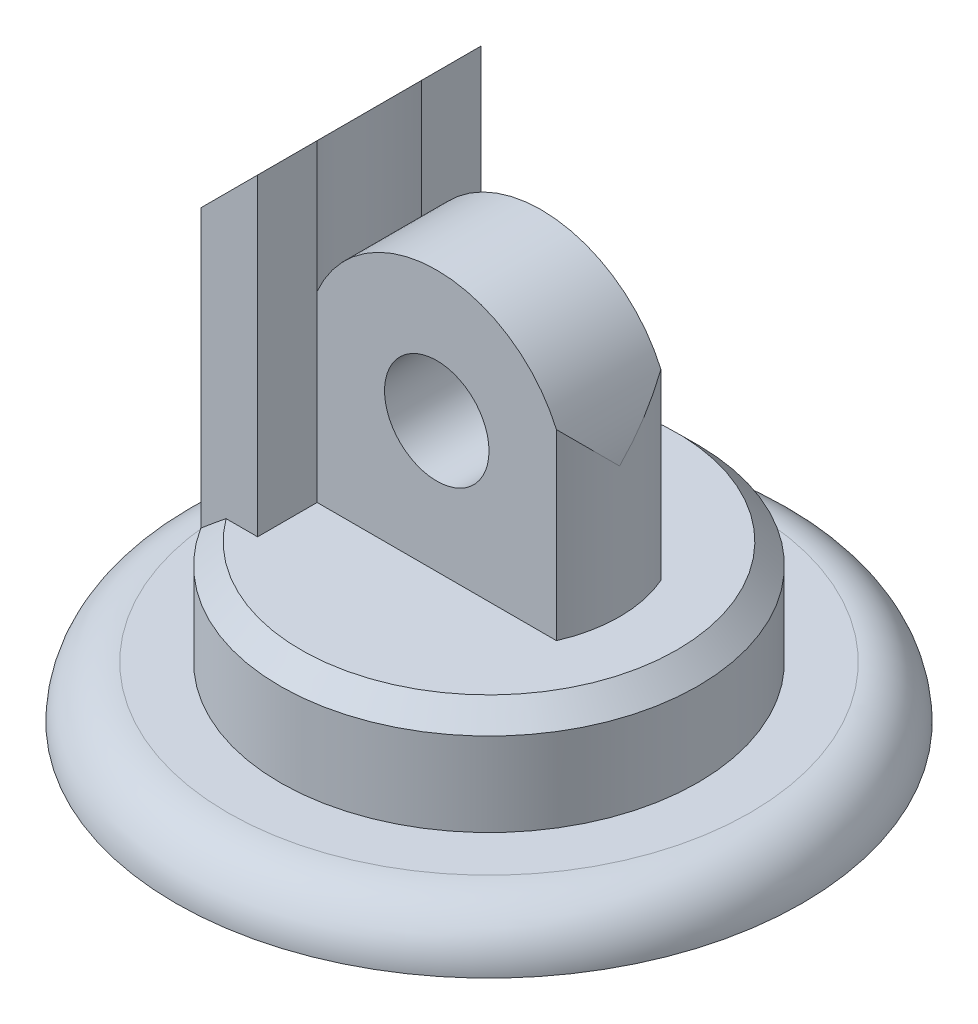
ISO-10303-21;
HEADER;
FILE_DESCRIPTION(('STEP AP214'),'2;1');
FILE_NAME('part.step','',(''),(''),'','','');
FILE_SCHEMA(('AUTOMOTIVE_DESIGN { 1 0 10303 214 1 1 1 1 }'));
ENDSEC;
DATA;
#1=APPLICATION_CONTEXT('core data for automotive mechanical design processes');
#2=APPLICATION_PROTOCOL_DEFINITION('international standard','automotive_design',2000,#1);
#3=PRODUCT_CONTEXT('',#1,'mechanical');
#4=PRODUCT('Part','Part','',(#3));
#5=PRODUCT_RELATED_PRODUCT_CATEGORY('part','',(#4));
#6=PRODUCT_DEFINITION_FORMATION('','',#4);
#7=PRODUCT_DEFINITION_CONTEXT('part definition',#1,'design');
#8=PRODUCT_DEFINITION('design','',#6,#7);
#9=PRODUCT_DEFINITION_SHAPE('','',#8);
#10=(LENGTH_UNIT() NAMED_UNIT(*) SI_UNIT(.MILLI.,.METRE.));
#11=(NAMED_UNIT(*) PLANE_ANGLE_UNIT() SI_UNIT($,.RADIAN.));
#12=(NAMED_UNIT(*) SI_UNIT($,.STERADIAN.) SOLID_ANGLE_UNIT());
#13=UNCERTAINTY_MEASURE_WITH_UNIT(LENGTH_MEASURE(1.E-05),#10,'distance_accuracy_value','');
#14=(GEOMETRIC_REPRESENTATION_CONTEXT(3) GLOBAL_UNCERTAINTY_ASSIGNED_CONTEXT((#13)) GLOBAL_UNIT_ASSIGNED_CONTEXT((#10,
#11,#12)) REPRESENTATION_CONTEXT('',''));
#15=CARTESIAN_POINT('',(0.,0.,0.));
#16=DIRECTION('',(0.,0.,1.));
#17=DIRECTION('',(1.,0.,0.));
#18=AXIS2_PLACEMENT_3D('',#15,#16,#17);
#19=CARTESIAN_POINT('',(0.,-25.,0.));
#20=DIRECTION('',(0.,-1.,0.));
#21=DIRECTION('',(0.,0.,-1.));
#22=AXIS2_PLACEMENT_3D('',#19,#20,#21);
#23=PLANE('',#22);
#24=DIRECTION('',(1.,0.,0.));
#25=VECTOR('',#24,1.);
#26=CARTESIAN_POINT('',(-22.9128784747792,-25.,21.393596310755));
#27=LINE('',#26,#25);
#28=CARTESIAN_POINT('',(-28.9536532564105,-25.,21.393596310755));
#29=VERTEX_POINT('',#28);
#30=CARTESIAN_POINT('',(-22.9128784747792,-25.,21.393596310755));
#31=VERTEX_POINT('',#30);
#32=EDGE_CURVE('E160',#29,#31,#27,.T.);
#33=ORIENTED_EDGE('',*,*,#32,.F.);
#34=CARTESIAN_POINT('',(0.,-25.,0.));
#35=DIRECTION('',(0.,-1.,0.));
#36=DIRECTION('',(0.,0.,-1.));
#37=AXIS2_PLACEMENT_3D('',#34,#35,#36);
#38=CIRCLE('',#37,36.);
#39=CARTESIAN_POINT('',(-28.9536532564105,-25.,-21.393596310755));
#40=VERTEX_POINT('',#39);
#41=EDGE_CURVE('E80',#29,#40,#38,.F.);
#42=ORIENTED_EDGE('',*,*,#41,.T.);
#43=DIRECTION('',(-1.,0.,0.));
#44=VECTOR('',#43,1.);
#45=CARTESIAN_POINT('',(-22.9128784747792,-25.,-21.393596310755));
#46=LINE('',#45,#44);
#47=CARTESIAN_POINT('',(-22.9128784747792,-25.,-21.393596310755));
#48=VERTEX_POINT('',#47);
#49=EDGE_CURVE('E181',#48,#40,#46,.T.);
#50=ORIENTED_EDGE('',*,*,#49,.F.);
#51=DIRECTION('',(0.,0.,-1.));
#52=VECTOR('',#51,1.);
#53=CARTESIAN_POINT('',(-22.9128784747792,-25.,-10.));
#54=LINE('',#53,#52);
#55=CARTESIAN_POINT('',(-22.9128784747792,-25.,-10.));
#56=VERTEX_POINT('',#55);
#57=EDGE_CURVE('E178',#56,#48,#54,.T.);
#58=ORIENTED_EDGE('',*,*,#57,.F.);
#59=DIRECTION('',(1.,0.,0.));
#60=VECTOR('',#59,1.);
#61=CARTESIAN_POINT('',(-25.,-25.,-10.));
#62=LINE('',#61,#60);
#63=CARTESIAN_POINT('',(22.9128784747792,-25.,-10.));
#64=VERTEX_POINT('',#63);
#65=EDGE_CURVE('E235',#56,#64,#62,.T.);
#66=ORIENTED_EDGE('',*,*,#65,.T.);
#67=CARTESIAN_POINT('',(0.,-25.,0.));
#68=DIRECTION('',(0.,1.,0.));
#69=DIRECTION('',(0.,0.,1.));
#70=AXIS2_PLACEMENT_3D('',#67,#68,#69);
#71=CIRCLE('',#70,25.);
#72=CARTESIAN_POINT('',(22.9128784747792,-25.,10.));
#73=VERTEX_POINT('',#72);
#74=EDGE_CURVE('E221',#73,#64,#71,.T.);
#75=ORIENTED_EDGE('',*,*,#74,.F.);
#76=DIRECTION('',(1.,0.,0.));
#77=VECTOR('',#76,1.);
#78=CARTESIAN_POINT('',(-25.,-25.,10.));
#79=LINE('',#78,#77);
#80=CARTESIAN_POINT('',(-22.9128784747792,-25.,10.));
#81=VERTEX_POINT('',#80);
#82=EDGE_CURVE('E227',#81,#73,#79,.T.);
#83=ORIENTED_EDGE('',*,*,#82,.F.);
#84=DIRECTION('',(0.,0.,-1.));
#85=VECTOR('',#84,1.);
#86=CARTESIAN_POINT('',(-22.9128784747792,-25.,10.));
#87=LINE('',#86,#85);
#88=EDGE_CURVE('E174',#31,#81,#87,.T.);
#89=ORIENTED_EDGE('',*,*,#88,.F.);
#90=EDGE_LOOP('',(#33,#42,#50,#58,#66,#75,#83,#89));
#91=FACE_BOUND('',#90,.T.);
#92=ADVANCED_FACE('F58',(#91),#23,.F.);
#93=CARTESIAN_POINT('',(0.,0.,10.));
#94=DIRECTION('',(0.,0.,1.));
#95=DIRECTION('',(1.,0.,0.));
#96=AXIS2_PLACEMENT_3D('',#93,#94,#95);
#97=PLANE('',#96);
#98=CARTESIAN_POINT('',(0.,0.,10.));
#99=DIRECTION('',(0.,0.,1.));
#100=DIRECTION('',(1.,0.,0.));
#101=AXIS2_PLACEMENT_3D('',#98,#99,#100);
#102=CIRCLE('',#101,10.);
#103=CARTESIAN_POINT('',(10.,0.,10.));
#104=VERTEX_POINT('',#103);
#105=EDGE_CURVE('E195',#104,#104,#102,.T.);
#106=ORIENTED_EDGE('',*,*,#105,.F.);
#107=EDGE_LOOP('',(#106));
#108=FACE_BOUND('',#107,.T.);
#109=CARTESIAN_POINT('',(0.,0.,10.));
#110=DIRECTION('',(0.,0.,-1.));
#111=DIRECTION('',(-1.,0.,0.));
#112=AXIS2_PLACEMENT_3D('',#109,#110,#111);
#113=CIRCLE('',#112,25.);
#114=CARTESIAN_POINT('',(-22.9128784747792,10.,10.));
#115=VERTEX_POINT('',#114);
#116=CARTESIAN_POINT('',(22.9128784747792,10.,10.));
#117=VERTEX_POINT('',#116);
#118=EDGE_CURVE('E214',#115,#117,#113,.T.);
#119=ORIENTED_EDGE('',*,*,#118,.F.);
#120=DIRECTION('',(0.,1.,0.));
#121=VECTOR('',#120,1.);
#122=CARTESIAN_POINT('',(-22.9128784747792,-25.,10.));
#123=LINE('',#122,#121);
#124=EDGE_CURVE('E219',#81,#115,#123,.T.);
#125=ORIENTED_EDGE('',*,*,#124,.F.);
#126=ORIENTED_EDGE('',*,*,#82,.T.);
#127=DIRECTION('',(0.,1.,0.));
#128=VECTOR('',#127,1.);
#129=CARTESIAN_POINT('',(22.9128784747792,-25.,10.));
#130=LINE('',#129,#128);
#131=EDGE_CURVE('E216',#73,#117,#130,.T.);
#132=ORIENTED_EDGE('',*,*,#131,.T.);
#133=EDGE_LOOP('',(#119,#125,#126,#132));
#134=FACE_BOUND('',#133,.T.);
#135=ADVANCED_FACE('F300',(#108,#134),#97,.T.);
#136=CARTESIAN_POINT('',(0.,0.,-10.));
#137=DIRECTION('',(0.,0.,1.));
#138=DIRECTION('',(1.,0.,0.));
#139=AXIS2_PLACEMENT_3D('',#136,#137,#138);
#140=PLANE('',#139);
#141=CARTESIAN_POINT('',(0.,0.,-10.));
#142=DIRECTION('',(0.,0.,1.));
#143=DIRECTION('',(1.,0.,0.));
#144=AXIS2_PLACEMENT_3D('',#141,#142,#143);
#145=CIRCLE('',#144,10.);
#146=CARTESIAN_POINT('',(10.,0.,-10.));
#147=VERTEX_POINT('',#146);
#148=EDGE_CURVE('E198',#147,#147,#145,.T.);
#149=ORIENTED_EDGE('',*,*,#148,.T.);
#150=EDGE_LOOP('',(#149));
#151=FACE_BOUND('',#150,.T.);
#152=DIRECTION('',(0.,1.,0.));
#153=VECTOR('',#152,1.);
#154=CARTESIAN_POINT('',(-22.9128784747792,-25.,-10.));
#155=LINE('',#154,#153);
#156=CARTESIAN_POINT('',(-22.9128784747792,10.,-10.));
#157=VERTEX_POINT('',#156);
#158=EDGE_CURVE('E224',#56,#157,#155,.T.);
#159=ORIENTED_EDGE('',*,*,#158,.T.);
#160=CARTESIAN_POINT('',(0.,0.,-10.));
#161=DIRECTION('',(0.,0.,-1.));
#162=DIRECTION('',(-1.,0.,0.));
#163=AXIS2_PLACEMENT_3D('',#160,#161,#162);
#164=CIRCLE('',#163,25.);
#165=CARTESIAN_POINT('',(22.9128784747792,10.,-10.));
#166=VERTEX_POINT('',#165);
#167=EDGE_CURVE('E213',#157,#166,#164,.T.);
#168=ORIENTED_EDGE('',*,*,#167,.T.);
#169=DIRECTION('',(0.,1.,0.));
#170=VECTOR('',#169,1.);
#171=CARTESIAN_POINT('',(22.9128784747792,-25.,-10.));
#172=LINE('',#171,#170);
#173=EDGE_CURVE('E228',#64,#166,#172,.T.);
#174=ORIENTED_EDGE('',*,*,#173,.F.);
#175=ORIENTED_EDGE('',*,*,#65,.F.);
#176=EDGE_LOOP('',(#159,#168,#174,#175));
#177=FACE_BOUND('',#176,.T.);
#178=ADVANCED_FACE('F311',(#151,#177),#140,.F.);
#179=CARTESIAN_POINT('',(0.,-25.,0.));
#180=DIRECTION('',(0.,1.,0.));
#181=DIRECTION('',(0.,0.,1.));
#182=AXIS2_PLACEMENT_3D('',#179,#180,#181);
#183=CYLINDRICAL_SURFACE('',#182,25.);
#184=CARTESIAN_POINT('',(0.,0.,0.));
#185=DIRECTION('',(0.,0.707106781186547,0.707106781186547));
#186=DIRECTION('',(0.,0.707106781186547,-0.707106781186547));
#187=AXIS2_PLACEMENT_3D('',#184,#185,#186);
#188=ELLIPSE('',#187,35.3553390593274,25.);
#189=CARTESIAN_POINT('',(25.,0.,0.));
#190=VERTEX_POINT('',#189);
#191=EDGE_CURVE('E237',#166,#190,#188,.F.);
#192=ORIENTED_EDGE('',*,*,#191,.T.);
#193=CARTESIAN_POINT('',(0.,0.,0.));
#194=DIRECTION('',(0.,0.707106781186547,-0.707106781186547));
#195=DIRECTION('',(0.,0.707106781186547,0.707106781186547));
#196=AXIS2_PLACEMENT_3D('',#193,#194,#195);
#197=ELLIPSE('',#196,35.3553390593274,25.);
#198=EDGE_CURVE('E240',#190,#117,#197,.F.);
#199=ORIENTED_EDGE('',*,*,#198,.T.);
#200=ORIENTED_EDGE('',*,*,#131,.F.);
#201=ORIENTED_EDGE('',*,*,#74,.T.);
#202=ORIENTED_EDGE('',*,*,#173,.T.);
#203=EDGE_LOOP('',(#192,#199,#200,#201,#202));
#204=FACE_BOUND('',#203,.T.);
#205=ADVANCED_FACE('F307',(#204),#183,.T.);
#206=CARTESIAN_POINT('',(0.,0.,10.));
#207=DIRECTION('',(0.,0.,-1.));
#208=DIRECTION('',(-1.,0.,0.));
#209=AXIS2_PLACEMENT_3D('',#206,#207,#208);
#210=CYLINDRICAL_SURFACE('',#209,25.);
#211=ORIENTED_EDGE('',*,*,#191,.F.);
#212=ORIENTED_EDGE('',*,*,#167,.F.);
#213=CARTESIAN_POINT('',(0.,0.,0.));
#214=DIRECTION('',(0.,0.707106781186547,0.707106781186547));
#215=DIRECTION('',(0.,0.707106781186547,-0.707106781186547));
#216=AXIS2_PLACEMENT_3D('',#213,#214,#215);
#217=ELLIPSE('',#216,35.3553390593274,25.);
#218=CARTESIAN_POINT('',(-25.,0.,0.));
#219=VERTEX_POINT('',#218);
#220=EDGE_CURVE('E243',#219,#157,#217,.F.);
#221=ORIENTED_EDGE('',*,*,#220,.F.);
#222=CARTESIAN_POINT('',(0.,0.,0.));
#223=DIRECTION('',(0.,0.707106781186547,-0.707106781186547));
#224=DIRECTION('',(0.,0.707106781186547,0.707106781186547));
#225=AXIS2_PLACEMENT_3D('',#222,#223,#224);
#226=ELLIPSE('',#225,35.3553390593274,25.);
#227=EDGE_CURVE('E207',#115,#219,#226,.F.);
#228=ORIENTED_EDGE('',*,*,#227,.F.);
#229=ORIENTED_EDGE('',*,*,#118,.T.);
#230=ORIENTED_EDGE('',*,*,#198,.F.);
#231=EDGE_LOOP('',(#211,#212,#221,#228,#229,#230));
#232=FACE_BOUND('',#231,.T.);
#233=ADVANCED_FACE('F303',(#232),#210,.T.);
#234=CARTESIAN_POINT('',(0.,-45.,0.));
#235=DIRECTION('',(0.,1.,0.));
#236=DIRECTION('',(0.,0.,1.));
#237=AXIS2_PLACEMENT_3D('',#234,#235,#236);
#238=CYLINDRICAL_SURFACE('',#237,40.);
#239=CARTESIAN_POINT('',(0.,-45.,0.));
#240=DIRECTION('',(0.,-1.,0.));
#241=DIRECTION('',(0.,0.,-1.));
#242=AXIS2_PLACEMENT_3D('',#239,#240,#241);
#243=CIRCLE('',#242,40.);
#244=CARTESIAN_POINT('',(0.,-45.,-40.));
#245=VERTEX_POINT('',#244);
#246=EDGE_CURVE('E210',#245,#245,#243,.T.);
#247=ORIENTED_EDGE('',*,*,#246,.F.);
#248=EDGE_LOOP('',(#247));
#249=FACE_BOUND('',#248,.T.);
#250=CARTESIAN_POINT('',(0.,-29.,0.));
#251=DIRECTION('',(0.,-1.,0.));
#252=DIRECTION('',(0.,0.,-1.));
#253=AXIS2_PLACEMENT_3D('',#250,#251,#252);
#254=CIRCLE('',#253,40.);
#255=CARTESIAN_POINT('',(-33.7981365890555,-29.,-21.393596310755));
#256=VERTEX_POINT('',#255);
#257=CARTESIAN_POINT('',(-33.7981365890555,-29.,21.393596310755));
#258=VERTEX_POINT('',#257);
#259=EDGE_CURVE('E252',#256,#258,#254,.T.);
#260=ORIENTED_EDGE('',*,*,#259,.T.);
#261=DIRECTION('',(0.,-1.,0.));
#262=VECTOR('',#261,1.);
#263=CARTESIAN_POINT('',(-33.7981365890555,35.,21.393596310755));
#264=LINE('',#263,#262);
#265=CARTESIAN_POINT('',(-33.7981365890555,24.1147418857235,21.393596310755));
#266=VERTEX_POINT('',#265);
#267=EDGE_CURVE('E164',#266,#258,#264,.T.);
#268=ORIENTED_EDGE('',*,*,#267,.F.);
#269=CARTESIAN_POINT('',(0.,57.9128784747796,0.));
#270=DIRECTION('',(0.707106781186554,-0.707106781186542,0.));
#271=DIRECTION('',(0.707106781186542,0.707106781186554,0.));
#272=AXIS2_PLACEMENT_3D('',#269,#270,#271);
#273=ELLIPSE('',#272,56.5685424949243,40.);
#274=CARTESIAN_POINT('',(-33.7981365890555,24.1147418857235,-21.393596310755));
#275=VERTEX_POINT('',#274);
#276=EDGE_CURVE('E153',#266,#275,#273,.T.);
#277=ORIENTED_EDGE('',*,*,#276,.T.);
#278=DIRECTION('',(0.,-1.,0.));
#279=VECTOR('',#278,1.);
#280=CARTESIAN_POINT('',(-33.7981365890555,35.,-21.393596310755));
#281=LINE('',#280,#279);
#282=EDGE_CURVE('E187',#275,#256,#281,.T.);
#283=ORIENTED_EDGE('',*,*,#282,.T.);
#284=EDGE_LOOP('',(#260,#268,#277,#283));
#285=FACE_BOUND('',#284,.T.);
#286=ADVANCED_FACE('F293',(#249,#285),#238,.T.);
#287=CARTESIAN_POINT('',(0.,-55.,0.));
#288=DIRECTION('',(0.,-1.,0.));
#289=DIRECTION('',(0.,0.,-1.));
#290=AXIS2_PLACEMENT_3D('',#287,#288,#289);
#291=PLANE('',#290);
#292=CARTESIAN_POINT('',(0.,-55.,0.));
#293=DIRECTION('',(0.,-1.,0.));
#294=DIRECTION('',(0.,0.,-1.));
#295=AXIS2_PLACEMENT_3D('',#292,#293,#294);
#296=CIRCLE('',#295,10.);
#297=CARTESIAN_POINT('',(0.,-55.,-10.));
#298=VERTEX_POINT('',#297);
#299=EDGE_CURVE('E203',#298,#298,#296,.T.);
#300=ORIENTED_EDGE('',*,*,#299,.F.);
#301=EDGE_LOOP('',(#300));
#302=FACE_BOUND('',#301,.T.);
#303=CARTESIAN_POINT('',(0.,-55.,0.));
#304=DIRECTION('',(0.,-1.,0.));
#305=DIRECTION('',(0.,0.,-1.));
#306=AXIS2_PLACEMENT_3D('',#303,#304,#305);
#307=CIRCLE('',#306,60.);
#308=CARTESIAN_POINT('',(0.,-55.,-60.));
#309=VERTEX_POINT('',#308);
#310=EDGE_CURVE('E202',#309,#309,#307,.T.);
#311=ORIENTED_EDGE('',*,*,#310,.T.);
#312=EDGE_LOOP('',(#311));
#313=FACE_BOUND('',#312,.T.);
#314=ADVANCED_FACE('F290',(#302,#313),#291,.T.);
#315=CARTESIAN_POINT('',(0.,-45.,0.));
#316=DIRECTION('',(0.,-1.,0.));
#317=DIRECTION('',(0.,0.,-1.));
#318=AXIS2_PLACEMENT_3D('',#315,#316,#317);
#319=PLANE('',#318);
#320=CARTESIAN_POINT('',(0.,-45.,0.));
#321=DIRECTION('',(0.,-1.,0.));
#322=DIRECTION('',(0.,0.,-1.));
#323=AXIS2_PLACEMENT_3D('',#320,#321,#322);
#324=CIRCLE('',#323,50.);
#325=CARTESIAN_POINT('',(0.,-45.,-50.));
#326=VERTEX_POINT('',#325);
#327=EDGE_CURVE('E206',#326,#326,#324,.F.);
#328=ORIENTED_EDGE('',*,*,#327,.T.);
#329=EDGE_LOOP('',(#328));
#330=FACE_BOUND('',#329,.T.);
#331=ORIENTED_EDGE('',*,*,#246,.T.);
#332=EDGE_LOOP('',(#331));
#333=FACE_BOUND('',#332,.T.);
#334=ADVANCED_FACE('F288',(#330,#333),#319,.F.);
#335=CARTESIAN_POINT('',(0.,-75.,0.));
#336=DIRECTION('',(0.,1.,0.));
#337=DIRECTION('',(0.,0.,1.));
#338=AXIS2_PLACEMENT_3D('',#335,#336,#337);
#339=CYLINDRICAL_SURFACE('',#338,10.);
#340=CARTESIAN_POINT('',(0.,-75.,0.));
#341=DIRECTION('',(0.,-1.,0.));
#342=DIRECTION('',(0.,0.,-1.));
#343=AXIS2_PLACEMENT_3D('',#340,#341,#342);
#344=CIRCLE('',#343,10.);
#345=CARTESIAN_POINT('',(0.,-75.,-10.));
#346=VERTEX_POINT('',#345);
#347=EDGE_CURVE('E199',#346,#346,#344,.T.);
#348=ORIENTED_EDGE('',*,*,#347,.F.);
#349=EDGE_LOOP('',(#348));
#350=FACE_BOUND('',#349,.T.);
#351=ORIENTED_EDGE('',*,*,#299,.T.);
#352=EDGE_LOOP('',(#351));
#353=FACE_BOUND('',#352,.T.);
#354=ADVANCED_FACE('F284',(#350,#353),#339,.T.);
#355=CARTESIAN_POINT('',(0.,-75.,0.));
#356=DIRECTION('',(0.,-1.,0.));
#357=DIRECTION('',(0.,0.,-1.));
#358=AXIS2_PLACEMENT_3D('',#355,#356,#357);
#359=PLANE('',#358);
#360=ORIENTED_EDGE('',*,*,#347,.T.);
#361=EDGE_LOOP('',(#360));
#362=FACE_BOUND('',#361,.T.);
#363=ADVANCED_FACE('F280',(#362),#359,.T.);
#364=CARTESIAN_POINT('',(0.,0.,-60.));
#365=DIRECTION('',(0.,0.,1.));
#366=DIRECTION('',(1.,0.,0.));
#367=AXIS2_PLACEMENT_3D('',#364,#365,#366);
#368=CYLINDRICAL_SURFACE('',#367,10.);
#369=ORIENTED_EDGE('',*,*,#105,.T.);
#370=EDGE_LOOP('',(#369));
#371=FACE_BOUND('',#370,.T.);
#372=ORIENTED_EDGE('',*,*,#148,.F.);
#373=EDGE_LOOP('',(#372));
#374=FACE_BOUND('',#373,.T.);
#375=ADVANCED_FACE('F276',(#371,#374),#368,.F.);
#376=CARTESIAN_POINT('',(0.,35.,0.));
#377=DIRECTION('',(0.,-1.,0.));
#378=DIRECTION('',(0.,0.,-1.));
#379=AXIS2_PLACEMENT_3D('',#376,#377,#378);
#380=CYLINDRICAL_SURFACE('',#379,25.);
#381=DIRECTION('',(0.,-1.,0.));
#382=VECTOR('',#381,1.);
#383=CARTESIAN_POINT('',(-22.9128784747792,35.,-10.));
#384=LINE('',#383,#382);
#385=CARTESIAN_POINT('',(-22.9128784747792,35.,-10.));
#386=VERTEX_POINT('',#385);
#387=EDGE_CURVE('E192',#386,#157,#384,.T.);
#388=ORIENTED_EDGE('',*,*,#387,.F.);
#389=CARTESIAN_POINT('',(0.,57.9128784747796,0.));
#390=DIRECTION('',(0.707106781186554,-0.707106781186542,0.));
#391=DIRECTION('',(-0.707106781186542,-0.707106781186554,0.));
#392=AXIS2_PLACEMENT_3D('',#389,#390,#391);
#393=ELLIPSE('',#392,35.3553390593277,25.);
#394=CARTESIAN_POINT('',(-22.9128784747792,35.,10.));
#395=VERTEX_POINT('',#394);
#396=EDGE_CURVE('E182',#386,#395,#393,.F.);
#397=ORIENTED_EDGE('',*,*,#396,.T.);
#398=DIRECTION('',(0.,-1.,0.));
#399=VECTOR('',#398,1.);
#400=CARTESIAN_POINT('',(-22.9128784747792,35.,10.));
#401=LINE('',#400,#399);
#402=EDGE_CURVE('E165',#395,#115,#401,.T.);
#403=ORIENTED_EDGE('',*,*,#402,.T.);
#404=ORIENTED_EDGE('',*,*,#227,.T.);
#405=ORIENTED_EDGE('',*,*,#220,.T.);
#406=EDGE_LOOP('',(#388,#397,#403,#404,#405));
#407=FACE_BOUND('',#406,.T.);
#408=ADVANCED_FACE('F272',(#407),#380,.F.);
#409=CARTESIAN_POINT('',(-22.9128784747792,35.,-10.));
#410=DIRECTION('',(-1.,0.,0.));
#411=DIRECTION('',(0.,0.,1.));
#412=AXIS2_PLACEMENT_3D('',#409,#410,#411);
#413=PLANE('',#412);
#414=ORIENTED_EDGE('',*,*,#57,.T.);
#415=DIRECTION('',(0.,-1.,0.));
#416=VECTOR('',#415,1.);
#417=CARTESIAN_POINT('',(-22.9128784747792,35.,-21.393596310755));
#418=LINE('',#417,#416);
#419=CARTESIAN_POINT('',(-22.9128784747792,35.,-21.393596310755));
#420=VERTEX_POINT('',#419);
#421=EDGE_CURVE('E189',#420,#48,#418,.T.);
#422=ORIENTED_EDGE('',*,*,#421,.F.);
#423=DIRECTION('',(0.,0.,-1.));
#424=VECTOR('',#423,1.);
#425=CARTESIAN_POINT('',(-22.9128784747792,35.,-10.));
#426=LINE('',#425,#424);
#427=EDGE_CURVE('E171',#386,#420,#426,.T.);
#428=ORIENTED_EDGE('',*,*,#427,.F.);
#429=ORIENTED_EDGE('',*,*,#387,.T.);
#430=ORIENTED_EDGE('',*,*,#158,.F.);
#431=EDGE_LOOP('',(#414,#422,#428,#429,#430));
#432=FACE_BOUND('',#431,.T.);
#433=ADVANCED_FACE('F268',(#432),#413,.F.);
#434=CARTESIAN_POINT('',(-22.9128784747792,35.,-21.393596310755));
#435=DIRECTION('',(0.,0.,1.));
#436=DIRECTION('',(1.,0.,0.));
#437=AXIS2_PLACEMENT_3D('',#434,#435,#436);
#438=PLANE('',#437);
#439=ORIENTED_EDGE('',*,*,#282,.F.);
#440=DIRECTION('',(0.707106781186542,0.707106781186554,0.));
#441=VECTOR('',#440,1.);
#442=CARTESIAN_POINT('',(-22.9128784747792,35.,-21.393596310755));
#443=LINE('',#442,#441);
#444=EDGE_CURVE('E155',#275,#420,#443,.T.);
#445=ORIENTED_EDGE('',*,*,#444,.T.);
#446=ORIENTED_EDGE('',*,*,#421,.T.);
#447=ORIENTED_EDGE('',*,*,#49,.T.);
#448=CARTESIAN_POINT('',(-28.9536532564105,-25.,-21.393596310755));
#449=CARTESIAN_POINT('',(-29.3616308798071,-25.328132663782,-21.393596310755));
#450=CARTESIAN_POINT('',(-29.7684196528108,-25.6577397352971,-21.393596310755));
#451=CARTESIAN_POINT('',(-30.5797931984837,-26.3196260374522,-21.393596310755));
#452=CARTESIAN_POINT('',(-30.9843780509229,-26.6519051702854,-21.393596310755));
#453=CARTESIAN_POINT('',(-31.7915449252147,-27.318881043469,-21.393596310755));
#454=CARTESIAN_POINT('',(-32.1941269581479,-27.6535777704189,-21.393596310755));
#455=CARTESIAN_POINT('',(-32.9974650328682,-28.3251854838822,-21.393596310755));
#456=CARTESIAN_POINT('',(-33.3982210076101,-28.6620965506054,-21.393596310755));
#457=CARTESIAN_POINT('',(-33.7981365890555,-29.,-21.393596310755));
#458=B_SPLINE_CURVE_WITH_KNOTS('',3,(#448,#449,#450,#451,#452,#453,#454,#455,#456,#457),
.UNSPECIFIED.,.F.,.F.,(4,2,2,2,4),(0.,1.57067811875819,3.14129900453709,4.71191119115867,
6.28258058681186),.UNSPECIFIED.);
#459=EDGE_CURVE('E12',#40,#256,#458,.T.);
#460=ORIENTED_EDGE('',*,*,#459,.T.);
#461=EDGE_LOOP('',(#439,#445,#446,#447,#460));
#462=FACE_BOUND('',#461,.T.);
#463=ADVANCED_FACE('F263',(#462),#438,.F.);
#464=CARTESIAN_POINT('',(-22.9128784747792,35.,21.393596310755));
#465=DIRECTION('',(0.,0.,-1.));
#466=DIRECTION('',(-1.,0.,0.));
#467=AXIS2_PLACEMENT_3D('',#464,#465,#466);
#468=PLANE('',#467);
#469=DIRECTION('',(0.,-1.,0.));
#470=VECTOR('',#469,1.);
#471=CARTESIAN_POINT('',(-22.9128784747792,35.,21.393596310755));
#472=LINE('',#471,#470);
#473=CARTESIAN_POINT('',(-22.9128784747792,35.,21.393596310755));
#474=VERTEX_POINT('',#473);
#475=EDGE_CURVE('E158',#474,#31,#472,.T.);
#476=ORIENTED_EDGE('',*,*,#475,.F.);
#477=DIRECTION('',(0.707106781186542,0.707106781186554,0.));
#478=VECTOR('',#477,1.);
#479=CARTESIAN_POINT('',(-22.9128784747792,35.,21.393596310755));
#480=LINE('',#479,#478);
#481=EDGE_CURVE('E146',#266,#474,#480,.T.);
#482=ORIENTED_EDGE('',*,*,#481,.F.);
#483=ORIENTED_EDGE('',*,*,#267,.T.);
#484=CARTESIAN_POINT('',(-33.7981365890555,-29.,21.393596310755));
#485=CARTESIAN_POINT('',(-33.3982210076101,-28.6620965506054,21.393596310755));
#486=CARTESIAN_POINT('',(-32.9974650328682,-28.3251854838822,21.393596310755));
#487=CARTESIAN_POINT('',(-32.1941269581479,-27.6535777704189,21.393596310755));
#488=CARTESIAN_POINT('',(-31.7915449252148,-27.318881043469,21.393596310755));
#489=CARTESIAN_POINT('',(-30.984378050923,-26.6519051702854,21.393596310755));
#490=CARTESIAN_POINT('',(-30.5797931984837,-26.3196260374522,21.393596310755));
#491=CARTESIAN_POINT('',(-29.7684196528108,-25.6577397352971,21.393596310755));
#492=CARTESIAN_POINT('',(-29.3616308798071,-25.328132663782,21.393596310755));
#493=CARTESIAN_POINT('',(-28.9536532564105,-25.,21.393596310755));
#494=B_SPLINE_CURVE_WITH_KNOTS('',3,(#484,#485,#486,#487,#488,#489,#490,#491,#492,#493),
.UNSPECIFIED.,.F.,.F.,(4,2,2,2,4),(0.,1.57066939565319,3.14128158227477,4.71190246805367,
6.28258058681187),.UNSPECIFIED.);
#495=EDGE_CURVE('E73',#258,#29,#494,.T.);
#496=ORIENTED_EDGE('',*,*,#495,.T.);
#497=ORIENTED_EDGE('',*,*,#32,.T.);
#498=EDGE_LOOP('',(#476,#482,#483,#496,#497));
#499=FACE_BOUND('',#498,.T.);
#500=ADVANCED_FACE('F159',(#499),#468,.F.);
#501=CARTESIAN_POINT('',(-22.9128784747792,35.,10.));
#502=DIRECTION('',(-1.,0.,0.));
#503=DIRECTION('',(0.,0.,1.));
#504=AXIS2_PLACEMENT_3D('',#501,#502,#503);
#505=PLANE('',#504);
#506=ORIENTED_EDGE('',*,*,#88,.T.);
#507=ORIENTED_EDGE('',*,*,#124,.T.);
#508=ORIENTED_EDGE('',*,*,#402,.F.);
#509=DIRECTION('',(0.,0.,-1.));
#510=VECTOR('',#509,1.);
#511=CARTESIAN_POINT('',(-22.9128784747792,35.,10.));
#512=LINE('',#511,#510);
#513=EDGE_CURVE('E150',#474,#395,#512,.T.);
#514=ORIENTED_EDGE('',*,*,#513,.F.);
#515=ORIENTED_EDGE('',*,*,#475,.T.);
#516=EDGE_LOOP('',(#506,#507,#508,#514,#515));
#517=FACE_BOUND('',#516,.T.);
#518=ADVANCED_FACE('F168',(#517),#505,.F.);
#519=CARTESIAN_POINT('',(-22.9128784747792,35.,-60.));
#520=DIRECTION('',(0.707106781186554,-0.707106781186542,0.));
#521=DIRECTION('',(0.707106781186542,0.707106781186554,0.));
#522=AXIS2_PLACEMENT_3D('',#519,#520,#521);
#523=PLANE('',#522);
#524=ORIENTED_EDGE('',*,*,#427,.T.);
#525=ORIENTED_EDGE('',*,*,#444,.F.);
#526=ORIENTED_EDGE('',*,*,#276,.F.);
#527=ORIENTED_EDGE('',*,*,#481,.T.);
#528=ORIENTED_EDGE('',*,*,#513,.T.);
#529=ORIENTED_EDGE('',*,*,#396,.F.);
#530=EDGE_LOOP('',(#524,#525,#526,#527,#528,#529));
#531=FACE_BOUND('',#530,.T.);
#532=ADVANCED_FACE('F148',(#531),#523,.F.);
#533=CARTESIAN_POINT('',(0.,-55.,0.));
#534=DIRECTION('',(0.,-1.,0.));
#535=DIRECTION('',(0.,0.,-1.));
#536=AXIS2_PLACEMENT_3D('',#533,#534,#535);
#537=TOROIDAL_SURFACE('',#536,50.,10.);
#538=ORIENTED_EDGE('',*,*,#327,.F.);
#539=EDGE_LOOP('',(#538));
#540=FACE_BOUND('',#539,.T.);
#541=ORIENTED_EDGE('',*,*,#310,.F.);
#542=EDGE_LOOP('',(#541));
#543=FACE_BOUND('',#542,.T.);
#544=ADVANCED_FACE('F318',(#540,#543),#537,.T.);
#545=CARTESIAN_POINT('',(0.,-29.,0.));
#546=DIRECTION('',(0.,-1.,0.));
#547=DIRECTION('',(0.,0.,-1.));
#548=AXIS2_PLACEMENT_3D('',#545,#546,#547);
#549=CONICAL_SURFACE('',#548,40.,0.785398163397448);
#550=ORIENTED_EDGE('',*,*,#459,.F.);
#551=ORIENTED_EDGE('',*,*,#41,.F.);
#552=ORIENTED_EDGE('',*,*,#495,.F.);
#553=ORIENTED_EDGE('',*,*,#259,.F.);
#554=EDGE_LOOP('',(#550,#551,#552,#553));
#555=FACE_BOUND('',#554,.T.);
#556=ADVANCED_FACE('F61',(#555),#549,.T.);
#557=CLOSED_SHELL('',(#92,#135,#178,#205,#233,#286,#314,#334,#354,#363,#375,#408,#433,#463,#500,
#518,#532,#544,#556));
#558=MANIFOLD_SOLID_BREP('B2',#557);
#559=ADVANCED_BREP_SHAPE_REPRESENTATION('',(#18,#558),#14);
#560=SHAPE_DEFINITION_REPRESENTATION(#9,#559);
ENDSEC;
END-ISO-10303-21;
